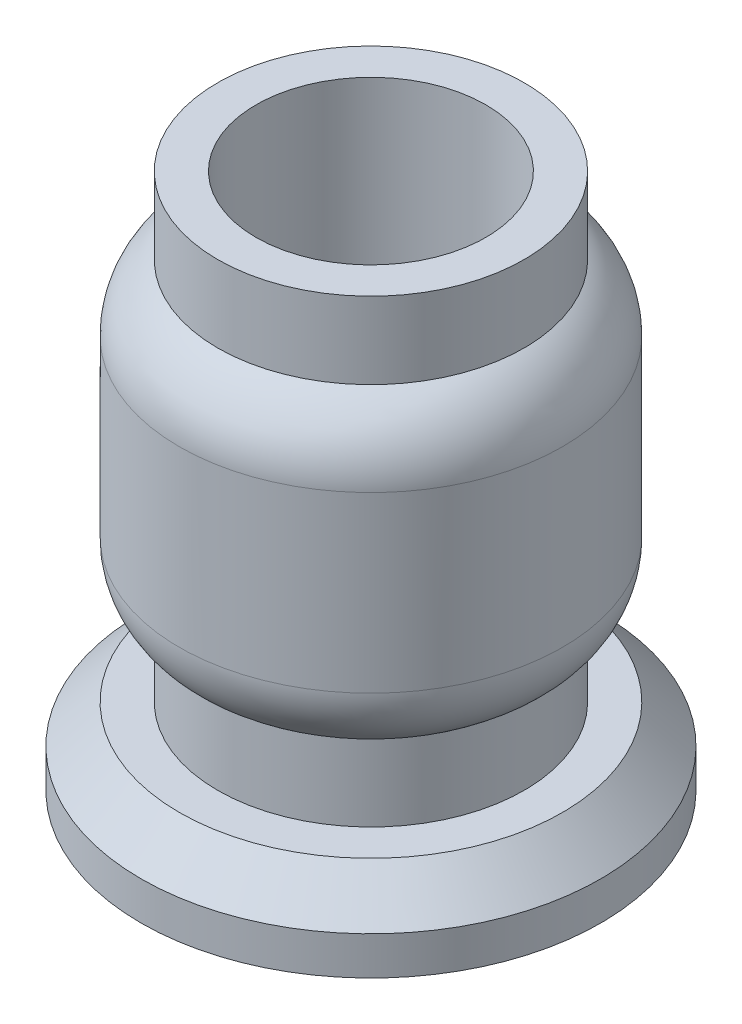
ISO-10303-21;
HEADER;
FILE_DESCRIPTION(('STEP AP214'),'2;1');
FILE_NAME('part.step','',(''),(''),'','','');
FILE_SCHEMA(('AUTOMOTIVE_DESIGN { 1 0 10303 214 1 1 1 1 }'));
ENDSEC;
DATA;
#1=APPLICATION_CONTEXT('core data for automotive mechanical design processes');
#2=APPLICATION_PROTOCOL_DEFINITION('international standard','automotive_design',2000,#1);
#3=PRODUCT_CONTEXT('',#1,'mechanical');
#4=PRODUCT('Part','Part','',(#3));
#5=PRODUCT_RELATED_PRODUCT_CATEGORY('part','',(#4));
#6=PRODUCT_DEFINITION_FORMATION('','',#4);
#7=PRODUCT_DEFINITION_CONTEXT('part definition',#1,'design');
#8=PRODUCT_DEFINITION('design','',#6,#7);
#9=PRODUCT_DEFINITION_SHAPE('','',#8);
#10=(LENGTH_UNIT() NAMED_UNIT(*) SI_UNIT(.MILLI.,.METRE.));
#11=(NAMED_UNIT(*) PLANE_ANGLE_UNIT() SI_UNIT($,.RADIAN.));
#12=(NAMED_UNIT(*) SI_UNIT($,.STERADIAN.) SOLID_ANGLE_UNIT());
#13=UNCERTAINTY_MEASURE_WITH_UNIT(LENGTH_MEASURE(1.E-05),#10,'distance_accuracy_value','');
#14=(GEOMETRIC_REPRESENTATION_CONTEXT(3) GLOBAL_UNCERTAINTY_ASSIGNED_CONTEXT((#13)) GLOBAL_UNIT_ASSIGNED_CONTEXT((#10,
#11,#12)) REPRESENTATION_CONTEXT('',''));
#15=CARTESIAN_POINT('',(0.,0.,0.));
#16=DIRECTION('',(0.,0.,1.));
#17=DIRECTION('',(1.,0.,0.));
#18=AXIS2_PLACEMENT_3D('',#15,#16,#17);
#19=CARTESIAN_POINT('',(0.,1.,0.));
#20=DIRECTION('',(0.,-1.,0.));
#21=DIRECTION('',(0.,0.,-0.999999999999999));
#22=AXIS2_PLACEMENT_3D('',#19,#20,#21);
#23=CYLINDRICAL_SURFACE('',#22,3.);
#24=CARTESIAN_POINT('',(0.,0.5,0.));
#25=DIRECTION('',(0.,1.,0.));
#26=DIRECTION('',(0.,0.,0.999999999999999));
#27=AXIS2_PLACEMENT_3D('',#24,#25,#26);
#28=CIRCLE('',#27,3.);
#29=CARTESIAN_POINT('',(0.,0.5,3.));
#30=VERTEX_POINT('',#29);
#31=EDGE_CURVE('E51',#30,#30,#28,.F.);
#32=ORIENTED_EDGE('',*,*,#31,.T.);
#33=EDGE_LOOP('',(#32));
#34=FACE_BOUND('',#33,.T.);
#35=CARTESIAN_POINT('',(0.,0.,0.));
#36=DIRECTION('',(0.,1.,0.));
#37=DIRECTION('',(0.,0.,0.999999999999999));
#38=AXIS2_PLACEMENT_3D('',#35,#36,#37);
#39=CIRCLE('',#38,3.);
#40=CARTESIAN_POINT('',(0.,0.,3.));
#41=VERTEX_POINT('',#40);
#42=EDGE_CURVE('E58',#41,#41,#39,.T.);
#43=ORIENTED_EDGE('',*,*,#42,.T.);
#44=EDGE_LOOP('',(#43));
#45=FACE_BOUND('',#44,.T.);
#46=ADVANCED_FACE('F36',(#34,#45),#23,.T.);
#47=CARTESIAN_POINT('',(0.,1.,0.));
#48=DIRECTION('',(0.,1.,0.));
#49=DIRECTION('',(0.,0.,0.999999999999999));
#50=AXIS2_PLACEMENT_3D('',#47,#48,#49);
#51=PLANE('',#50);
#52=CARTESIAN_POINT('',(0.,1.,0.));
#53=DIRECTION('',(0.,1.,0.));
#54=DIRECTION('',(0.,0.,0.999999999999999));
#55=AXIS2_PLACEMENT_3D('',#52,#53,#54);
#56=CIRCLE('',#55,2.);
#57=CARTESIAN_POINT('',(0.,1.,2.));
#58=VERTEX_POINT('',#57);
#59=EDGE_CURVE('E54',#58,#58,#56,.T.);
#60=ORIENTED_EDGE('',*,*,#59,.F.);
#61=EDGE_LOOP('',(#60));
#62=FACE_BOUND('',#61,.T.);
#63=CARTESIAN_POINT('',(0.,1.,0.));
#64=DIRECTION('',(0.,1.,0.));
#65=DIRECTION('',(0.,0.,0.999999999999999));
#66=AXIS2_PLACEMENT_3D('',#63,#64,#65);
#67=CIRCLE('',#66,2.5);
#68=CARTESIAN_POINT('',(0.,1.,2.5));
#69=VERTEX_POINT('',#68);
#70=EDGE_CURVE('E55',#69,#69,#67,.T.);
#71=ORIENTED_EDGE('',*,*,#70,.T.);
#72=EDGE_LOOP('',(#71));
#73=FACE_BOUND('',#72,.T.);
#74=ADVANCED_FACE('F103',(#62,#73),#51,.T.);
#75=CARTESIAN_POINT('',(0.,0.,0.));
#76=DIRECTION('',(0.,1.,0.));
#77=DIRECTION('',(0.,0.,0.999999999999999));
#78=AXIS2_PLACEMENT_3D('',#75,#76,#77);
#79=PLANE('',#78);
#80=CARTESIAN_POINT('',(0.,0.,0.));
#81=DIRECTION('',(0.,-1.,0.));
#82=DIRECTION('',(0.,0.,-0.999999999999999));
#83=AXIS2_PLACEMENT_3D('',#80,#81,#82);
#84=CIRCLE('',#83,1.5);
#85=CARTESIAN_POINT('',(0.,0.,-1.5));
#86=VERTEX_POINT('',#85);
#87=EDGE_CURVE('E71',#86,#86,#84,.T.);
#88=ORIENTED_EDGE('',*,*,#87,.F.);
#89=EDGE_LOOP('',(#88));
#90=FACE_BOUND('',#89,.T.);
#91=ORIENTED_EDGE('',*,*,#42,.F.);
#92=EDGE_LOOP('',(#91));
#93=FACE_BOUND('',#92,.T.);
#94=ADVANCED_FACE('F109',(#90,#93),#79,.F.);
#95=CARTESIAN_POINT('',(0.,1.,0.));
#96=DIRECTION('',(0.,-1.,0.));
#97=DIRECTION('',(0.,0.,-0.999999999999999));
#98=AXIS2_PLACEMENT_3D('',#95,#96,#97);
#99=CONICAL_SURFACE('',#98,2.5,0.785398163397447);
#100=ORIENTED_EDGE('',*,*,#31,.F.);
#101=EDGE_LOOP('',(#100));
#102=FACE_BOUND('',#101,.T.);
#103=ORIENTED_EDGE('',*,*,#70,.F.);
#104=EDGE_LOOP('',(#103));
#105=FACE_BOUND('',#104,.T.);
#106=ADVANCED_FACE('F114',(#102,#105),#99,.T.);
#107=CARTESIAN_POINT('',(0.,2.,0.));
#108=DIRECTION('',(0.,-1.,0.));
#109=DIRECTION('',(0.,0.,-0.999999999999999));
#110=AXIS2_PLACEMENT_3D('',#107,#108,#109);
#111=CYLINDRICAL_SURFACE('',#110,2.);
#112=CARTESIAN_POINT('',(0.,2.,0.));
#113=DIRECTION('',(0.,1.,0.));
#114=DIRECTION('',(0.,0.,0.999999999999999));
#115=AXIS2_PLACEMENT_3D('',#112,#113,#114);
#116=CIRCLE('',#115,2.);
#117=CARTESIAN_POINT('',(0.,2.,2.));
#118=VERTEX_POINT('',#117);
#119=EDGE_CURVE('E61',#118,#118,#116,.T.);
#120=ORIENTED_EDGE('',*,*,#119,.F.);
#121=EDGE_LOOP('',(#120));
#122=FACE_BOUND('',#121,.T.);
#123=ORIENTED_EDGE('',*,*,#59,.T.);
#124=EDGE_LOOP('',(#123));
#125=FACE_BOUND('',#124,.T.);
#126=ADVANCED_FACE('F116',(#122,#125),#111,.T.);
#127=CARTESIAN_POINT('',(0.,6.,0.));
#128=DIRECTION('',(0.,-1.,0.));
#129=DIRECTION('',(0.,0.,-0.999999999999999));
#130=AXIS2_PLACEMENT_3D('',#127,#128,#129);
#131=CYLINDRICAL_SURFACE('',#130,2.5);
#132=CARTESIAN_POINT('',(0.,2.86602540378444,0.));
#133=DIRECTION('',(0.,-1.,0.));
#134=DIRECTION('',(0.,0.,-0.999999999999999));
#135=AXIS2_PLACEMENT_3D('',#132,#133,#134);
#136=CIRCLE('',#135,2.5);
#137=CARTESIAN_POINT('',(0.,2.86602540378444,-2.5));
#138=VERTEX_POINT('',#137);
#139=EDGE_CURVE('E10',#138,#138,#136,.F.);
#140=ORIENTED_EDGE('',*,*,#139,.T.);
#141=EDGE_LOOP('',(#140));
#142=FACE_BOUND('',#141,.T.);
#143=CARTESIAN_POINT('',(0.,5.13397459621556,0.));
#144=DIRECTION('',(0.,1.,0.));
#145=DIRECTION('',(0.,0.,0.999999999999999));
#146=AXIS2_PLACEMENT_3D('',#143,#144,#145);
#147=CIRCLE('',#146,2.5);
#148=CARTESIAN_POINT('',(0.,5.13397459621556,2.5));
#149=VERTEX_POINT('',#148);
#150=EDGE_CURVE('E44',#149,#149,#147,.F.);
#151=ORIENTED_EDGE('',*,*,#150,.T.);
#152=EDGE_LOOP('',(#151));
#153=FACE_BOUND('',#152,.T.);
#154=ADVANCED_FACE('F90',(#142,#153),#131,.T.);
#155=CARTESIAN_POINT('',(0.,7.,0.));
#156=DIRECTION('',(0.,-1.,0.));
#157=DIRECTION('',(0.,0.,-0.999999999999999));
#158=AXIS2_PLACEMENT_3D('',#155,#156,#157);
#159=CYLINDRICAL_SURFACE('',#158,2.);
#160=CARTESIAN_POINT('',(0.,7.,0.));
#161=DIRECTION('',(0.,1.,0.));
#162=DIRECTION('',(0.,0.,0.999999999999999));
#163=AXIS2_PLACEMENT_3D('',#160,#161,#162);
#164=CIRCLE('',#163,2.);
#165=CARTESIAN_POINT('',(0.,7.,2.));
#166=VERTEX_POINT('',#165);
#167=EDGE_CURVE('E66',#166,#166,#164,.T.);
#168=ORIENTED_EDGE('',*,*,#167,.F.);
#169=EDGE_LOOP('',(#168));
#170=FACE_BOUND('',#169,.T.);
#171=CARTESIAN_POINT('',(0.,6.,0.));
#172=DIRECTION('',(0.,1.,0.));
#173=DIRECTION('',(0.,0.,0.999999999999999));
#174=AXIS2_PLACEMENT_3D('',#171,#172,#173);
#175=CIRCLE('',#174,2.);
#176=CARTESIAN_POINT('',(0.,6.,2.));
#177=VERTEX_POINT('',#176);
#178=EDGE_CURVE('E48',#177,#177,#175,.T.);
#179=ORIENTED_EDGE('',*,*,#178,.T.);
#180=EDGE_LOOP('',(#179));
#181=FACE_BOUND('',#180,.T.);
#182=ADVANCED_FACE('F84',(#170,#181),#159,.T.);
#183=CARTESIAN_POINT('',(0.,7.,0.));
#184=DIRECTION('',(0.,1.,0.));
#185=DIRECTION('',(0.,0.,0.999999999999999));
#186=AXIS2_PLACEMENT_3D('',#183,#184,#185);
#187=PLANE('',#186);
#188=CARTESIAN_POINT('',(0.,7.,0.));
#189=DIRECTION('',(0.,1.,0.));
#190=DIRECTION('',(0.,0.,0.999999999999999));
#191=AXIS2_PLACEMENT_3D('',#188,#189,#190);
#192=CIRCLE('',#191,1.5);
#193=CARTESIAN_POINT('',(0.,7.,1.5));
#194=VERTEX_POINT('',#193);
#195=EDGE_CURVE('E40',#194,#194,#192,.T.);
#196=ORIENTED_EDGE('',*,*,#195,.F.);
#197=EDGE_LOOP('',(#196));
#198=FACE_BOUND('',#197,.T.);
#199=ORIENTED_EDGE('',*,*,#167,.T.);
#200=EDGE_LOOP('',(#199));
#201=FACE_BOUND('',#200,.T.);
#202=ADVANCED_FACE('F80',(#198,#201),#187,.T.);
#203=CARTESIAN_POINT('',(0.,5.13397459621556,0.));
#204=DIRECTION('',(0.,1.,0.));
#205=DIRECTION('',(0.,0.,0.999999999999999));
#206=AXIS2_PLACEMENT_3D('',#203,#204,#205);
#207=TOROIDAL_SURFACE('',#206,1.5,1.);
#208=ORIENTED_EDGE('',*,*,#150,.F.);
#209=EDGE_LOOP('',(#208));
#210=FACE_BOUND('',#209,.T.);
#211=ORIENTED_EDGE('',*,*,#178,.F.);
#212=EDGE_LOOP('',(#211));
#213=FACE_BOUND('',#212,.T.);
#214=ADVANCED_FACE('F83',(#210,#213),#207,.T.);
#215=CARTESIAN_POINT('',(0.,2.86602540378444,0.));
#216=DIRECTION('',(0.,-1.,0.));
#217=DIRECTION('',(0.,0.,-0.999999999999999));
#218=AXIS2_PLACEMENT_3D('',#215,#216,#217);
#219=TOROIDAL_SURFACE('',#218,1.5,1.);
#220=ORIENTED_EDGE('',*,*,#119,.T.);
#221=EDGE_LOOP('',(#220));
#222=FACE_BOUND('',#221,.T.);
#223=ORIENTED_EDGE('',*,*,#139,.F.);
#224=EDGE_LOOP('',(#223));
#225=FACE_BOUND('',#224,.T.);
#226=ADVANCED_FACE('F38',(#222,#225),#219,.T.);
#227=CARTESIAN_POINT('',(0.,10.,0.));
#228=DIRECTION('',(0.,-1.,0.));
#229=DIRECTION('',(0.,0.,-0.999999999999999));
#230=AXIS2_PLACEMENT_3D('',#227,#228,#229);
#231=CYLINDRICAL_SURFACE('',#230,1.5);
#232=ORIENTED_EDGE('',*,*,#195,.T.);
#233=EDGE_LOOP('',(#232));
#234=FACE_BOUND('',#233,.T.);
#235=ORIENTED_EDGE('',*,*,#87,.T.);
#236=EDGE_LOOP('',(#235));
#237=FACE_BOUND('',#236,.T.);
#238=ADVANCED_FACE('F78',(#234,#237),#231,.F.);
#239=CLOSED_SHELL('',(#46,#74,#94,#106,#126,#154,#182,#202,#214,#226,#238));
#240=MANIFOLD_SOLID_BREP('B2',#239);
#241=ADVANCED_BREP_SHAPE_REPRESENTATION('',(#18,#240),#14);
#242=SHAPE_DEFINITION_REPRESENTATION(#9,#241);
ENDSEC;
END-ISO-10303-21;
